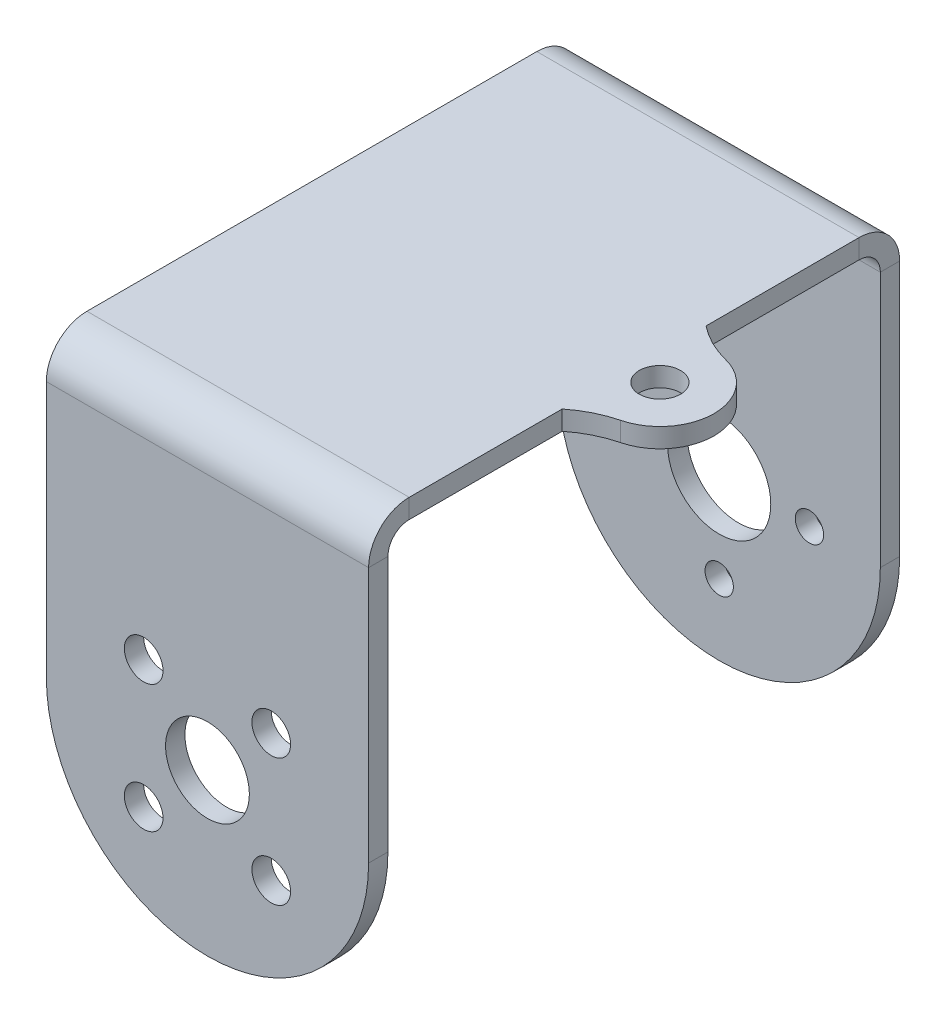
ISO-10303-21;
HEADER;
FILE_DESCRIPTION(('STEP AP214'),'2;1');
FILE_NAME('part.step','',(''),(''),'','','');
FILE_SCHEMA(('AUTOMOTIVE_DESIGN { 1 0 10303 214 1 1 1 1 }'));
ENDSEC;
DATA;
#1=APPLICATION_CONTEXT('core data for automotive mechanical design processes');
#2=APPLICATION_PROTOCOL_DEFINITION('international standard','automotive_design',2000,#1);
#3=PRODUCT_CONTEXT('',#1,'mechanical');
#4=PRODUCT('Part','Part','',(#3));
#5=PRODUCT_RELATED_PRODUCT_CATEGORY('part','',(#4));
#6=PRODUCT_DEFINITION_FORMATION('','',#4);
#7=PRODUCT_DEFINITION_CONTEXT('part definition',#1,'design');
#8=PRODUCT_DEFINITION('design','',#6,#7);
#9=PRODUCT_DEFINITION_SHAPE('','',#8);
#10=(LENGTH_UNIT() NAMED_UNIT(*) SI_UNIT(.MILLI.,.METRE.));
#11=(NAMED_UNIT(*) PLANE_ANGLE_UNIT() SI_UNIT($,.RADIAN.));
#12=(NAMED_UNIT(*) SI_UNIT($,.STERADIAN.) SOLID_ANGLE_UNIT());
#13=UNCERTAINTY_MEASURE_WITH_UNIT(LENGTH_MEASURE(1.E-05),#10,'distance_accuracy_value','');
#14=(GEOMETRIC_REPRESENTATION_CONTEXT(3) GLOBAL_UNCERTAINTY_ASSIGNED_CONTEXT((#13)) GLOBAL_UNIT_ASSIGNED_CONTEXT((#10,
#11,#12)) REPRESENTATION_CONTEXT('',''));
#15=CARTESIAN_POINT('',(0.,0.,0.));
#16=DIRECTION('',(0.,0.,1.));
#17=DIRECTION('',(1.,0.,0.));
#18=AXIS2_PLACEMENT_3D('',#15,#16,#17);
#19=CARTESIAN_POINT('',(12.5,-1.5,19.1));
#20=DIRECTION('',(1.,0.,0.));
#21=DIRECTION('',(0.,0.,-1.));
#22=AXIS2_PLACEMENT_3D('',#19,#20,#21);
#23=PLANE('',#22);
#24=DIRECTION('',(0.,-1.,0.));
#25=VECTOR('',#24,1.);
#26=CARTESIAN_POINT('',(12.5,0.,-5.58170194678879));
#27=LINE('',#26,#25);
#28=CARTESIAN_POINT('',(12.5,0.,-5.58170194678879));
#29=VERTEX_POINT('',#28);
#30=CARTESIAN_POINT('',(12.5,-1.5,-5.58170194678879));
#31=VERTEX_POINT('',#30);
#32=EDGE_CURVE('E225',#29,#31,#27,.T.);
#33=ORIENTED_EDGE('',*,*,#32,.T.);
#34=DIRECTION('',(0.,0.,-1.));
#35=VECTOR('',#34,1.);
#36=CARTESIAN_POINT('',(12.5,-1.5,19.1));
#37=LINE('',#36,#35);
#38=CARTESIAN_POINT('',(12.5,-1.50000000000001,-17.45));
#39=VERTEX_POINT('',#38);
#40=EDGE_CURVE('E434',#31,#39,#37,.T.);
#41=ORIENTED_EDGE('',*,*,#40,.T.);
#42=DIRECTION('',(0.,1.,0.));
#43=VECTOR('',#42,1.);
#44=CARTESIAN_POINT('',(12.5,-1.50000000000001,-17.45));
#45=LINE('',#44,#43);
#46=CARTESIAN_POINT('',(12.5,0.,-17.45));
#47=VERTEX_POINT('',#46);
#48=EDGE_CURVE('E350',#39,#47,#45,.T.);
#49=ORIENTED_EDGE('',*,*,#48,.T.);
#50=DIRECTION('',(0.,0.,-1.));
#51=VECTOR('',#50,1.);
#52=CARTESIAN_POINT('',(12.5,0.,19.1));
#53=LINE('',#52,#51);
#54=EDGE_CURVE('E67',#29,#47,#53,.T.);
#55=ORIENTED_EDGE('',*,*,#54,.F.);
#56=EDGE_LOOP('',(#33,#41,#49,#55));
#57=FACE_BOUND('',#56,.T.);
#58=ADVANCED_FACE('F49',(#57),#23,.T.);
#59=CARTESIAN_POINT('',(0.,-1.5,0.));
#60=DIRECTION('',(0.,1.,0.));
#61=DIRECTION('',(0.,0.,1.));
#62=AXIS2_PLACEMENT_3D('',#59,#60,#61);
#63=PLANE('',#62);
#64=DIRECTION('',(1.,0.,0.));
#65=VECTOR('',#64,1.);
#66=CARTESIAN_POINT('',(12.5,-1.50000000000001,-17.45));
#67=LINE('',#66,#65);
#68=CARTESIAN_POINT('',(-12.5,-1.50000000000001,-17.45));
#69=VERTEX_POINT('',#68);
#70=EDGE_CURVE('E358',#39,#69,#67,.F.);
#71=ORIENTED_EDGE('',*,*,#70,.F.);
#72=ORIENTED_EDGE('',*,*,#40,.F.);
#73=CARTESIAN_POINT('',(17.5,-1.5,-11.8266999451872));
#74=DIRECTION('',(0.,1.,0.));
#75=DIRECTION('',(0.,0.,-1.));
#76=AXIS2_PLACEMENT_3D('',#73,#74,#75);
#77=CIRCLE('',#76,8.);
#78=CARTESIAN_POINT('',(15.5329906036473,-1.5,-4.07228997184557));
#79=VERTEX_POINT('',#78);
#80=EDGE_CURVE('E205',#31,#79,#77,.T.);
#81=ORIENTED_EDGE('',*,*,#80,.T.);
#82=CARTESIAN_POINT('',(14.5,-1.5,-1.30104260698261E-12));
#83=DIRECTION('',(0.,-1.,0.));
#84=DIRECTION('',(0.,0.,-1.));
#85=AXIS2_PLACEMENT_3D('',#82,#83,#84);
#86=CIRCLE('',#85,4.20126352446582);
#87=CARTESIAN_POINT('',(15.5329906036473,-1.5,4.07228997184297));
#88=VERTEX_POINT('',#87);
#89=EDGE_CURVE('E217',#79,#88,#86,.T.);
#90=ORIENTED_EDGE('',*,*,#89,.T.);
#91=CARTESIAN_POINT('',(17.5,-1.5,11.8266999451846));
#92=DIRECTION('',(0.,1.,0.));
#93=DIRECTION('',(0.,0.,-1.));
#94=AXIS2_PLACEMENT_3D('',#91,#92,#93);
#95=CIRCLE('',#94,8.);
#96=CARTESIAN_POINT('',(12.5,-1.5,5.58170194678619));
#97=VERTEX_POINT('',#96);
#98=EDGE_CURVE('E183',#88,#97,#95,.T.);
#99=ORIENTED_EDGE('',*,*,#98,.T.);
#100=CARTESIAN_POINT('',(12.5,-1.5,17.45));
#101=VERTEX_POINT('',#100);
#102=EDGE_CURVE('E435',#101,#97,#37,.T.);
#103=ORIENTED_EDGE('',*,*,#102,.F.);
#104=DIRECTION('',(-1.,0.,0.));
#105=VECTOR('',#104,1.);
#106=CARTESIAN_POINT('',(-12.5,-1.5,17.45));
#107=LINE('',#106,#105);
#108=CARTESIAN_POINT('',(-12.5,-1.5,17.45));
#109=VERTEX_POINT('',#108);
#110=EDGE_CURVE('E416',#109,#101,#107,.F.);
#111=ORIENTED_EDGE('',*,*,#110,.F.);
#112=DIRECTION('',(0.,0.,1.));
#113=VECTOR('',#112,1.);
#114=CARTESIAN_POINT('',(-12.5,-1.5,19.1));
#115=LINE('',#114,#113);
#116=EDGE_CURVE('E430',#69,#109,#115,.T.);
#117=ORIENTED_EDGE('',*,*,#116,.F.);
#118=EDGE_LOOP('',(#71,#72,#81,#90,#99,#103,#111,#117));
#119=FACE_BOUND('',#118,.T.);
#120=CARTESIAN_POINT('',(14.5,-1.5,-1.30104260698261E-12));
#121=DIRECTION('',(0.,-1.,0.));
#122=DIRECTION('',(0.,0.,-1.));
#123=AXIS2_PLACEMENT_3D('',#120,#121,#122);
#124=CIRCLE('',#123,1.6);
#125=CARTESIAN_POINT('',(14.5,-1.5,-1.6000000000013));
#126=VERTEX_POINT('',#125);
#127=EDGE_CURVE('E212',#126,#126,#124,.T.);
#128=ORIENTED_EDGE('',*,*,#127,.F.);
#129=EDGE_LOOP('',(#128));
#130=FACE_BOUND('',#129,.T.);
#131=ADVANCED_FACE('F530',(#119,#130),#63,.F.);
#132=CARTESIAN_POINT('',(0.,0.,0.));
#133=DIRECTION('',(0.,1.,0.));
#134=DIRECTION('',(0.,0.,1.));
#135=AXIS2_PLACEMENT_3D('',#132,#133,#134);
#136=PLANE('',#135);
#137=CARTESIAN_POINT('',(12.5,0.,17.45));
#138=VERTEX_POINT('',#137);
#139=CARTESIAN_POINT('',(12.5,0.,5.58170194678619));
#140=VERTEX_POINT('',#139);
#141=EDGE_CURVE('E199',#138,#140,#53,.T.);
#142=ORIENTED_EDGE('',*,*,#141,.T.);
#143=CARTESIAN_POINT('',(17.5,0.,11.8266999451846));
#144=DIRECTION('',(0.,1.,0.));
#145=DIRECTION('',(0.,0.,-1.));
#146=AXIS2_PLACEMENT_3D('',#143,#144,#145);
#147=CIRCLE('',#146,8.);
#148=CARTESIAN_POINT('',(15.5329906036473,0.,4.07228997184297));
#149=VERTEX_POINT('',#148);
#150=EDGE_CURVE('E181',#149,#140,#147,.T.);
#151=ORIENTED_EDGE('',*,*,#150,.F.);
#152=CARTESIAN_POINT('',(14.5,0.,-1.30104260698261E-12));
#153=DIRECTION('',(0.,-1.,0.));
#154=DIRECTION('',(0.,0.,-1.));
#155=AXIS2_PLACEMENT_3D('',#152,#153,#154);
#156=CIRCLE('',#155,4.20126352446582);
#157=CARTESIAN_POINT('',(15.5329906036473,0.,-4.07228997184557));
#158=VERTEX_POINT('',#157);
#159=EDGE_CURVE('E196',#158,#149,#156,.T.);
#160=ORIENTED_EDGE('',*,*,#159,.F.);
#161=CARTESIAN_POINT('',(17.5,0.,-11.8266999451872));
#162=DIRECTION('',(0.,1.,0.));
#163=DIRECTION('',(0.,0.,-1.));
#164=AXIS2_PLACEMENT_3D('',#161,#162,#163);
#165=CIRCLE('',#164,8.);
#166=EDGE_CURVE('E189',#29,#158,#165,.T.);
#167=ORIENTED_EDGE('',*,*,#166,.F.);
#168=ORIENTED_EDGE('',*,*,#54,.T.);
#169=DIRECTION('',(1.,0.,0.));
#170=VECTOR('',#169,1.);
#171=CARTESIAN_POINT('',(12.5,0.,-17.45));
#172=LINE('',#171,#170);
#173=CARTESIAN_POINT('',(-12.5,0.,-17.45));
#174=VERTEX_POINT('',#173);
#175=EDGE_CURVE('E341',#47,#174,#172,.F.);
#176=ORIENTED_EDGE('',*,*,#175,.T.);
#177=DIRECTION('',(0.,0.,1.));
#178=VECTOR('',#177,1.);
#179=CARTESIAN_POINT('',(-12.5,0.,19.1));
#180=LINE('',#179,#178);
#181=CARTESIAN_POINT('',(-12.5,0.,17.45));
#182=VERTEX_POINT('',#181);
#183=EDGE_CURVE('E426',#174,#182,#180,.T.);
#184=ORIENTED_EDGE('',*,*,#183,.T.);
#185=DIRECTION('',(-1.,0.,0.));
#186=VECTOR('',#185,1.);
#187=CARTESIAN_POINT('',(-12.5,0.,17.45));
#188=LINE('',#187,#186);
#189=EDGE_CURVE('E400',#182,#138,#188,.F.);
#190=ORIENTED_EDGE('',*,*,#189,.T.);
#191=EDGE_LOOP('',(#142,#151,#160,#167,#168,#176,#184,#190));
#192=FACE_BOUND('',#191,.T.);
#193=CARTESIAN_POINT('',(14.5,0.,-1.30104260698261E-12));
#194=DIRECTION('',(0.,-1.,0.));
#195=DIRECTION('',(0.,0.,-1.));
#196=AXIS2_PLACEMENT_3D('',#193,#194,#195);
#197=CIRCLE('',#196,1.6);
#198=CARTESIAN_POINT('',(14.5,0.,-1.6000000000013));
#199=VERTEX_POINT('',#198);
#200=EDGE_CURVE('E220',#199,#199,#197,.T.);
#201=ORIENTED_EDGE('',*,*,#200,.T.);
#202=EDGE_LOOP('',(#201));
#203=FACE_BOUND('',#202,.T.);
#204=ADVANCED_FACE('F193',(#192,#203),#136,.T.);
#205=DIRECTION('',(0.,-1.,0.));
#206=VECTOR('',#205,1.);
#207=CARTESIAN_POINT('',(12.5,0.,5.58170194678619));
#208=LINE('',#207,#206);
#209=EDGE_CURVE('E75',#140,#97,#208,.T.);
#210=ORIENTED_EDGE('',*,*,#209,.F.);
#211=ORIENTED_EDGE('',*,*,#141,.F.);
#212=DIRECTION('',(0.,1.,0.));
#213=VECTOR('',#212,1.);
#214=CARTESIAN_POINT('',(12.5,-1.5,17.45));
#215=LINE('',#214,#213);
#216=EDGE_CURVE('E422',#101,#138,#215,.T.);
#217=ORIENTED_EDGE('',*,*,#216,.F.);
#218=ORIENTED_EDGE('',*,*,#102,.T.);
#219=EDGE_LOOP('',(#210,#211,#217,#218));
#220=FACE_BOUND('',#219,.T.);
#221=ADVANCED_FACE('F542',(#220),#23,.T.);
#222=CARTESIAN_POINT('',(-12.5,-1.5,19.1));
#223=DIRECTION('',(-1.,0.,0.));
#224=DIRECTION('',(0.,0.,1.));
#225=AXIS2_PLACEMENT_3D('',#222,#223,#224);
#226=PLANE('',#225);
#227=DIRECTION('',(0.,1.,0.));
#228=VECTOR('',#227,1.);
#229=CARTESIAN_POINT('',(-12.5,-1.50000000000001,-17.45));
#230=LINE('',#229,#228);
#231=EDGE_CURVE('E364',#69,#174,#230,.T.);
#232=ORIENTED_EDGE('',*,*,#231,.F.);
#233=ORIENTED_EDGE('',*,*,#116,.T.);
#234=DIRECTION('',(0.,1.,0.));
#235=VECTOR('',#234,1.);
#236=CARTESIAN_POINT('',(-12.5,-1.5,17.45));
#237=LINE('',#236,#235);
#238=EDGE_CURVE('E408',#109,#182,#237,.T.);
#239=ORIENTED_EDGE('',*,*,#238,.T.);
#240=ORIENTED_EDGE('',*,*,#183,.F.);
#241=EDGE_LOOP('',(#232,#233,#239,#240));
#242=FACE_BOUND('',#241,.T.);
#243=ADVANCED_FACE('F527',(#242),#226,.T.);
#244=CARTESIAN_POINT('',(12.5,-3.15,17.45));
#245=DIRECTION('',(1.,0.,0.));
#246=DIRECTION('',(0.,0.,-1.));
#247=AXIS2_PLACEMENT_3D('',#244,#245,#246);
#248=PLANE('',#247);
#249=DIRECTION('',(0.,0.,1.));
#250=VECTOR('',#249,1.);
#251=CARTESIAN_POINT('',(12.5,-3.15,19.1));
#252=LINE('',#251,#250);
#253=CARTESIAN_POINT('',(12.5,-3.14999999999999,19.1));
#254=VERTEX_POINT('',#253);
#255=CARTESIAN_POINT('',(12.5,-3.14999999999999,20.6));
#256=VERTEX_POINT('',#255);
#257=EDGE_CURVE('E368',#254,#256,#252,.T.);
#258=ORIENTED_EDGE('',*,*,#257,.F.);
#259=CARTESIAN_POINT('',(12.5,-3.15,17.45));
#260=DIRECTION('',(-1.,0.,0.));
#261=DIRECTION('',(0.,0.,1.));
#262=AXIS2_PLACEMENT_3D('',#259,#260,#261);
#263=CIRCLE('',#262,1.65);
#264=EDGE_CURVE('E412',#101,#254,#263,.F.);
#265=ORIENTED_EDGE('',*,*,#264,.F.);
#266=ORIENTED_EDGE('',*,*,#216,.T.);
#267=CARTESIAN_POINT('',(12.5,-3.15,17.45));
#268=DIRECTION('',(-1.,0.,0.));
#269=DIRECTION('',(0.,0.,1.));
#270=AXIS2_PLACEMENT_3D('',#267,#268,#269);
#271=CIRCLE('',#270,3.15);
#272=EDGE_CURVE('E403',#138,#256,#271,.F.);
#273=ORIENTED_EDGE('',*,*,#272,.T.);
#274=EDGE_LOOP('',(#258,#265,#266,#273));
#275=FACE_BOUND('',#274,.T.);
#276=ADVANCED_FACE('F541',(#275),#248,.T.);
#277=CARTESIAN_POINT('',(-12.5,-3.15,17.45));
#278=DIRECTION('',(1.,0.,0.));
#279=DIRECTION('',(0.,0.,-1.));
#280=AXIS2_PLACEMENT_3D('',#277,#278,#279);
#281=PLANE('',#280);
#282=CARTESIAN_POINT('',(-12.5,-3.15,17.45));
#283=DIRECTION('',(-1.,0.,0.));
#284=DIRECTION('',(0.,0.,1.));
#285=AXIS2_PLACEMENT_3D('',#282,#283,#284);
#286=CIRCLE('',#285,1.65);
#287=CARTESIAN_POINT('',(-12.5,-3.14999999999999,19.1));
#288=VERTEX_POINT('',#287);
#289=EDGE_CURVE('E394',#288,#109,#286,.T.);
#290=ORIENTED_EDGE('',*,*,#289,.F.);
#291=DIRECTION('',(0.,0.,1.));
#292=VECTOR('',#291,1.);
#293=CARTESIAN_POINT('',(-12.5,-3.15,19.1));
#294=LINE('',#293,#292);
#295=CARTESIAN_POINT('',(-12.5,-3.15,20.6));
#296=VERTEX_POINT('',#295);
#297=EDGE_CURVE('E374',#288,#296,#294,.T.);
#298=ORIENTED_EDGE('',*,*,#297,.T.);
#299=CARTESIAN_POINT('',(-12.5,-3.15,17.45));
#300=DIRECTION('',(-1.,0.,0.));
#301=DIRECTION('',(0.,0.,1.));
#302=AXIS2_PLACEMENT_3D('',#299,#300,#301);
#303=CIRCLE('',#302,3.15);
#304=EDGE_CURVE('E404',#296,#182,#303,.T.);
#305=ORIENTED_EDGE('',*,*,#304,.T.);
#306=ORIENTED_EDGE('',*,*,#238,.F.);
#307=EDGE_LOOP('',(#290,#298,#305,#306));
#308=FACE_BOUND('',#307,.T.);
#309=ADVANCED_FACE('F636',(#308),#281,.F.);
#310=CARTESIAN_POINT('',(-12.5,-3.15,17.45));
#311=DIRECTION('',(-1.,0.,0.));
#312=DIRECTION('',(0.,0.,1.));
#313=AXIS2_PLACEMENT_3D('',#310,#311,#312);
#314=CYLINDRICAL_SURFACE('',#313,3.15);
#315=ORIENTED_EDGE('',*,*,#189,.F.);
#316=ORIENTED_EDGE('',*,*,#304,.F.);
#317=DIRECTION('',(1.,0.,0.));
#318=VECTOR('',#317,1.);
#319=CARTESIAN_POINT('',(0.,-3.15,20.6));
#320=LINE('',#319,#318);
#321=EDGE_CURVE('E378',#296,#256,#320,.T.);
#322=ORIENTED_EDGE('',*,*,#321,.T.);
#323=ORIENTED_EDGE('',*,*,#272,.F.);
#324=EDGE_LOOP('',(#315,#316,#322,#323));
#325=FACE_BOUND('',#324,.T.);
#326=ADVANCED_FACE('F639',(#325),#314,.T.);
#327=CARTESIAN_POINT('',(-12.5,-3.15,17.45));
#328=DIRECTION('',(-1.,0.,0.));
#329=DIRECTION('',(0.,0.,1.));
#330=AXIS2_PLACEMENT_3D('',#327,#328,#329);
#331=CYLINDRICAL_SURFACE('',#330,1.65);
#332=ORIENTED_EDGE('',*,*,#110,.T.);
#333=ORIENTED_EDGE('',*,*,#264,.T.);
#334=DIRECTION('',(-1.,0.,0.));
#335=VECTOR('',#334,1.);
#336=CARTESIAN_POINT('',(12.5,-3.15,19.1));
#337=LINE('',#336,#335);
#338=EDGE_CURVE('E371',#254,#288,#337,.T.);
#339=ORIENTED_EDGE('',*,*,#338,.T.);
#340=ORIENTED_EDGE('',*,*,#289,.T.);
#341=EDGE_LOOP('',(#332,#333,#339,#340));
#342=FACE_BOUND('',#341,.T.);
#343=ADVANCED_FACE('F535',(#342),#331,.F.);
#344=CARTESIAN_POINT('',(-12.5,-35.5,20.6000000000001));
#345=DIRECTION('',(1.,0.,0.));
#346=DIRECTION('',(0.,1.,0.));
#347=AXIS2_PLACEMENT_3D('',#344,#345,#346);
#348=PLANE('',#347);
#349=DIRECTION('',(0.,-1.,0.));
#350=VECTOR('',#349,1.);
#351=CARTESIAN_POINT('',(-12.5,-35.5,19.1000000000001));
#352=LINE('',#351,#350);
#353=CARTESIAN_POINT('',(-12.5,-23.,19.1000000000001));
#354=VERTEX_POINT('',#353);
#355=EDGE_CURVE('E385',#288,#354,#352,.T.);
#356=ORIENTED_EDGE('',*,*,#355,.T.);
#357=DIRECTION('',(0.,0.,-1.));
#358=VECTOR('',#357,1.);
#359=CARTESIAN_POINT('',(-12.5,-23.,20.6000000000001));
#360=LINE('',#359,#358);
#361=CARTESIAN_POINT('',(-12.5,-23.,20.6000000000001));
#362=VERTEX_POINT('',#361);
#363=EDGE_CURVE('E459',#354,#362,#360,.F.);
#364=ORIENTED_EDGE('',*,*,#363,.T.);
#365=DIRECTION('',(0.,-1.,0.));
#366=VECTOR('',#365,1.);
#367=CARTESIAN_POINT('',(-12.5,-35.5,20.6000000000001));
#368=LINE('',#367,#366);
#369=EDGE_CURVE('E386',#296,#362,#368,.T.);
#370=ORIENTED_EDGE('',*,*,#369,.F.);
#371=ORIENTED_EDGE('',*,*,#297,.F.);
#372=EDGE_LOOP('',(#356,#364,#370,#371));
#373=FACE_BOUND('',#372,.T.);
#374=ADVANCED_FACE('F645',(#373),#348,.F.);
#375=CARTESIAN_POINT('',(12.5,-1.49999999999999,20.6));
#376=DIRECTION('',(-1.,0.,0.));
#377=DIRECTION('',(0.,0.,1.));
#378=AXIS2_PLACEMENT_3D('',#375,#376,#377);
#379=PLANE('',#378);
#380=DIRECTION('',(0.,1.,0.));
#381=VECTOR('',#380,1.);
#382=CARTESIAN_POINT('',(12.5,-1.49999999999999,20.6));
#383=LINE('',#382,#381);
#384=CARTESIAN_POINT('',(12.5,-23.,20.6000000000001));
#385=VERTEX_POINT('',#384);
#386=EDGE_CURVE('E390',#385,#256,#383,.T.);
#387=ORIENTED_EDGE('',*,*,#386,.F.);
#388=DIRECTION('',(0.,0.,-1.));
#389=VECTOR('',#388,1.);
#390=CARTESIAN_POINT('',(12.5,-23.,20.6000000000001));
#391=LINE('',#390,#389);
#392=CARTESIAN_POINT('',(12.5,-23.,19.1000000000001));
#393=VERTEX_POINT('',#392);
#394=EDGE_CURVE('E438',#385,#393,#391,.T.);
#395=ORIENTED_EDGE('',*,*,#394,.T.);
#396=DIRECTION('',(0.,1.,0.));
#397=VECTOR('',#396,1.);
#398=CARTESIAN_POINT('',(12.5,-1.5,19.1));
#399=LINE('',#398,#397);
#400=EDGE_CURVE('E391',#393,#254,#399,.T.);
#401=ORIENTED_EDGE('',*,*,#400,.T.);
#402=ORIENTED_EDGE('',*,*,#257,.T.);
#403=EDGE_LOOP('',(#387,#395,#401,#402));
#404=FACE_BOUND('',#403,.T.);
#405=ADVANCED_FACE('F651',(#404),#379,.F.);
#406=CARTESIAN_POINT('',(0.,0.,20.6));
#407=DIRECTION('',(0.,0.,-1.));
#408=DIRECTION('',(0.,1.,0.));
#409=AXIS2_PLACEMENT_3D('',#406,#407,#408);
#410=PLANE('',#409);
#411=CARTESIAN_POINT('',(4.94974746830584,-18.0502525316942,20.6));
#412=DIRECTION('',(0.,0.,1.));
#413=DIRECTION('',(1.,0.,0.));
#414=AXIS2_PLACEMENT_3D('',#411,#412,#413);
#415=CIRCLE('',#414,1.5);
#416=CARTESIAN_POINT('',(6.44974746830584,-18.0502525316942,20.6));
#417=VERTEX_POINT('',#416);
#418=EDGE_CURVE('E288',#417,#417,#415,.T.);
#419=ORIENTED_EDGE('',*,*,#418,.F.);
#420=EDGE_LOOP('',(#419));
#421=FACE_BOUND('',#420,.T.);
#422=CARTESIAN_POINT('',(-4.94974746830583,-27.9497474683058,20.6));
#423=DIRECTION('',(0.,0.,1.));
#424=DIRECTION('',(1.,0.,0.));
#425=AXIS2_PLACEMENT_3D('',#422,#423,#424);
#426=CIRCLE('',#425,1.5);
#427=CARTESIAN_POINT('',(-3.44974746830583,-27.9497474683058,20.6));
#428=VERTEX_POINT('',#427);
#429=EDGE_CURVE('E281',#428,#428,#426,.T.);
#430=ORIENTED_EDGE('',*,*,#429,.F.);
#431=EDGE_LOOP('',(#430));
#432=FACE_BOUND('',#431,.T.);
#433=CARTESIAN_POINT('',(4.94974746830584,-27.9497474683058,20.6));
#434=DIRECTION('',(0.,0.,1.));
#435=DIRECTION('',(1.,0.,0.));
#436=AXIS2_PLACEMENT_3D('',#433,#434,#435);
#437=CIRCLE('',#436,1.5);
#438=CARTESIAN_POINT('',(6.44974746830584,-27.9497474683058,20.6));
#439=VERTEX_POINT('',#438);
#440=EDGE_CURVE('E272',#439,#439,#437,.T.);
#441=ORIENTED_EDGE('',*,*,#440,.F.);
#442=EDGE_LOOP('',(#441));
#443=FACE_BOUND('',#442,.T.);
#444=CARTESIAN_POINT('',(0.,-23.,20.6));
#445=DIRECTION('',(0.,0.,1.));
#446=DIRECTION('',(1.,0.,0.));
#447=AXIS2_PLACEMENT_3D('',#444,#445,#446);
#448=CIRCLE('',#447,3.25000000000001);
#449=CARTESIAN_POINT('',(3.25000000000001,-23.,20.6));
#450=VERTEX_POINT('',#449);
#451=EDGE_CURVE('E268',#450,#450,#448,.T.);
#452=ORIENTED_EDGE('',*,*,#451,.F.);
#453=EDGE_LOOP('',(#452));
#454=FACE_BOUND('',#453,.T.);
#455=CARTESIAN_POINT('',(-4.94974746830583,-18.0502525316942,20.6));
#456=DIRECTION('',(0.,0.,1.));
#457=DIRECTION('',(1.,0.,0.));
#458=AXIS2_PLACEMENT_3D('',#455,#456,#457);
#459=CIRCLE('',#458,1.5);
#460=CARTESIAN_POINT('',(-3.44974746830583,-18.0502525316942,20.6));
#461=VERTEX_POINT('',#460);
#462=EDGE_CURVE('E307',#461,#461,#459,.T.);
#463=ORIENTED_EDGE('',*,*,#462,.F.);
#464=EDGE_LOOP('',(#463));
#465=FACE_BOUND('',#464,.T.);
#466=CARTESIAN_POINT('',(0.,-23.,20.6000000000001));
#467=DIRECTION('',(0.,0.,-1.));
#468=DIRECTION('',(0.,1.,0.));
#469=AXIS2_PLACEMENT_3D('',#466,#467,#468);
#470=CIRCLE('',#469,12.5);
#471=CARTESIAN_POINT('',(0.,-35.5,20.6000000000001));
#472=VERTEX_POINT('',#471);
#473=EDGE_CURVE('E453',#362,#472,#470,.F.);
#474=ORIENTED_EDGE('',*,*,#473,.T.);
#475=CARTESIAN_POINT('',(0.,-23.,20.6000000000001));
#476=DIRECTION('',(0.,0.,-1.));
#477=DIRECTION('',(0.,1.,0.));
#478=AXIS2_PLACEMENT_3D('',#475,#476,#477);
#479=CIRCLE('',#478,12.5);
#480=EDGE_CURVE('E456',#472,#385,#479,.F.);
#481=ORIENTED_EDGE('',*,*,#480,.T.);
#482=ORIENTED_EDGE('',*,*,#386,.T.);
#483=ORIENTED_EDGE('',*,*,#321,.F.);
#484=ORIENTED_EDGE('',*,*,#369,.T.);
#485=EDGE_LOOP('',(#474,#481,#482,#483,#484));
#486=FACE_BOUND('',#485,.T.);
#487=ADVANCED_FACE('F655',(#421,#432,#443,#454,#465,#486),#410,.F.);
#488=CARTESIAN_POINT('',(0.,0.,19.1));
#489=DIRECTION('',(0.,0.,-1.));
#490=DIRECTION('',(0.,1.,0.));
#491=AXIS2_PLACEMENT_3D('',#488,#489,#490);
#492=PLANE('',#491);
#493=CARTESIAN_POINT('',(4.94974746830584,-18.0502525316942,19.1000000000001));
#494=DIRECTION('',(0.,0.,-1.));
#495=DIRECTION('',(0.,1.,0.));
#496=AXIS2_PLACEMENT_3D('',#493,#494,#495);
#497=CIRCLE('',#496,1.5);
#498=CARTESIAN_POINT('',(4.94974746830584,-16.5502525316942,19.1000000000001));
#499=VERTEX_POINT('',#498);
#500=EDGE_CURVE('E292',#499,#499,#497,.F.);
#501=ORIENTED_EDGE('',*,*,#500,.T.);
#502=EDGE_LOOP('',(#501));
#503=FACE_BOUND('',#502,.T.);
#504=CARTESIAN_POINT('',(-4.94974746830583,-27.9497474683058,19.1000000000001));
#505=DIRECTION('',(0.,0.,-1.));
#506=DIRECTION('',(0.,1.,0.));
#507=AXIS2_PLACEMENT_3D('',#504,#505,#506);
#508=CIRCLE('',#507,1.5);
#509=CARTESIAN_POINT('',(-4.94974746830583,-26.4497474683058,19.1000000000001));
#510=VERTEX_POINT('',#509);
#511=EDGE_CURVE('E293',#510,#510,#508,.F.);
#512=ORIENTED_EDGE('',*,*,#511,.T.);
#513=EDGE_LOOP('',(#512));
#514=FACE_BOUND('',#513,.T.);
#515=CARTESIAN_POINT('',(4.94974746830584,-27.9497474683058,19.1000000000001));
#516=DIRECTION('',(0.,0.,-1.));
#517=DIRECTION('',(0.,1.,0.));
#518=AXIS2_PLACEMENT_3D('',#515,#516,#517);
#519=CIRCLE('',#518,1.5);
#520=CARTESIAN_POINT('',(4.94974746830584,-26.4497474683058,19.1000000000001));
#521=VERTEX_POINT('',#520);
#522=EDGE_CURVE('E276',#521,#521,#519,.F.);
#523=ORIENTED_EDGE('',*,*,#522,.T.);
#524=EDGE_LOOP('',(#523));
#525=FACE_BOUND('',#524,.T.);
#526=CARTESIAN_POINT('',(0.,-23.,19.1000000000001));
#527=DIRECTION('',(0.,0.,-1.));
#528=DIRECTION('',(0.,1.,0.));
#529=AXIS2_PLACEMENT_3D('',#526,#527,#528);
#530=CIRCLE('',#529,3.25000000000001);
#531=CARTESIAN_POINT('',(0.,-19.75,19.1000000000001));
#532=VERTEX_POINT('',#531);
#533=EDGE_CURVE('E277',#532,#532,#530,.F.);
#534=ORIENTED_EDGE('',*,*,#533,.T.);
#535=EDGE_LOOP('',(#534));
#536=FACE_BOUND('',#535,.T.);
#537=CARTESIAN_POINT('',(-4.94974746830583,-18.0502525316942,19.1000000000001));
#538=DIRECTION('',(0.,0.,-1.));
#539=DIRECTION('',(0.,1.,0.));
#540=AXIS2_PLACEMENT_3D('',#537,#538,#539);
#541=CIRCLE('',#540,1.5);
#542=CARTESIAN_POINT('',(-4.94974746830583,-16.5502525316942,19.1000000000001));
#543=VERTEX_POINT('',#542);
#544=EDGE_CURVE('E297',#543,#543,#541,.F.);
#545=ORIENTED_EDGE('',*,*,#544,.T.);
#546=EDGE_LOOP('',(#545));
#547=FACE_BOUND('',#546,.T.);
#548=ORIENTED_EDGE('',*,*,#400,.F.);
#549=CARTESIAN_POINT('',(0.,-23.,19.1000000000001));
#550=DIRECTION('',(0.,0.,-1.));
#551=DIRECTION('',(0.,1.,0.));
#552=AXIS2_PLACEMENT_3D('',#549,#550,#551);
#553=CIRCLE('',#552,12.5);
#554=CARTESIAN_POINT('',(0.,-35.5,19.1000000000001));
#555=VERTEX_POINT('',#554);
#556=EDGE_CURVE('E450',#393,#555,#553,.T.);
#557=ORIENTED_EDGE('',*,*,#556,.T.);
#558=CARTESIAN_POINT('',(0.,-23.,19.1000000000001));
#559=DIRECTION('',(0.,0.,-1.));
#560=DIRECTION('',(0.,1.,0.));
#561=AXIS2_PLACEMENT_3D('',#558,#559,#560);
#562=CIRCLE('',#561,12.5);
#563=EDGE_CURVE('E447',#555,#354,#562,.T.);
#564=ORIENTED_EDGE('',*,*,#563,.T.);
#565=ORIENTED_EDGE('',*,*,#355,.F.);
#566=ORIENTED_EDGE('',*,*,#338,.F.);
#567=EDGE_LOOP('',(#548,#557,#564,#565,#566));
#568=FACE_BOUND('',#567,.T.);
#569=ADVANCED_FACE('F657',(#503,#514,#525,#536,#547,#568),#492,.T.);
#570=CARTESIAN_POINT('',(-12.5,-3.15000000000001,-17.45));
#571=DIRECTION('',(-1.,0.,0.));
#572=DIRECTION('',(0.,0.,1.));
#573=AXIS2_PLACEMENT_3D('',#570,#571,#572);
#574=PLANE('',#573);
#575=DIRECTION('',(0.,0.,-1.));
#576=VECTOR('',#575,1.);
#577=CARTESIAN_POINT('',(-12.5,-3.15,-19.1));
#578=LINE('',#577,#576);
#579=CARTESIAN_POINT('',(-12.5,-3.15,-19.1));
#580=VERTEX_POINT('',#579);
#581=CARTESIAN_POINT('',(-12.5,-3.15,-20.6));
#582=VERTEX_POINT('',#581);
#583=EDGE_CURVE('E311',#580,#582,#578,.T.);
#584=ORIENTED_EDGE('',*,*,#583,.F.);
#585=CARTESIAN_POINT('',(-12.5,-3.15000000000001,-17.45));
#586=DIRECTION('',(1.,0.,0.));
#587=DIRECTION('',(0.,0.,-1.));
#588=AXIS2_PLACEMENT_3D('',#585,#586,#587);
#589=CIRCLE('',#588,1.65);
#590=EDGE_CURVE('E354',#69,#580,#589,.F.);
#591=ORIENTED_EDGE('',*,*,#590,.F.);
#592=ORIENTED_EDGE('',*,*,#231,.T.);
#593=CARTESIAN_POINT('',(-12.5,-3.15000000000001,-17.45));
#594=DIRECTION('',(1.,0.,0.));
#595=DIRECTION('',(0.,0.,-1.));
#596=AXIS2_PLACEMENT_3D('',#593,#594,#595);
#597=CIRCLE('',#596,3.15);
#598=EDGE_CURVE('E345',#174,#582,#597,.F.);
#599=ORIENTED_EDGE('',*,*,#598,.T.);
#600=EDGE_LOOP('',(#584,#591,#592,#599));
#601=FACE_BOUND('',#600,.T.);
#602=ADVANCED_FACE('F516',(#601),#574,.T.);
#603=CARTESIAN_POINT('',(12.5,-3.15000000000001,-17.45));
#604=DIRECTION('',(-1.,0.,0.));
#605=DIRECTION('',(0.,0.,1.));
#606=AXIS2_PLACEMENT_3D('',#603,#604,#605);
#607=PLANE('',#606);
#608=CARTESIAN_POINT('',(12.5,-3.15000000000001,-17.45));
#609=DIRECTION('',(1.,0.,0.));
#610=DIRECTION('',(0.,0.,-1.));
#611=AXIS2_PLACEMENT_3D('',#608,#609,#610);
#612=CIRCLE('',#611,1.65);
#613=CARTESIAN_POINT('',(12.5,-3.15,-19.1));
#614=VERTEX_POINT('',#613);
#615=EDGE_CURVE('E335',#614,#39,#612,.T.);
#616=ORIENTED_EDGE('',*,*,#615,.F.);
#617=DIRECTION('',(0.,0.,-1.));
#618=VECTOR('',#617,1.);
#619=CARTESIAN_POINT('',(12.5,-3.15,-19.1));
#620=LINE('',#619,#618);
#621=CARTESIAN_POINT('',(12.5,-3.14999999999999,-20.6));
#622=VERTEX_POINT('',#621);
#623=EDGE_CURVE('E315',#614,#622,#620,.T.);
#624=ORIENTED_EDGE('',*,*,#623,.T.);
#625=CARTESIAN_POINT('',(12.5,-3.15000000000001,-17.45));
#626=DIRECTION('',(1.,0.,0.));
#627=DIRECTION('',(0.,0.,-1.));
#628=AXIS2_PLACEMENT_3D('',#625,#626,#627);
#629=CIRCLE('',#628,3.15);
#630=EDGE_CURVE('E346',#622,#47,#629,.T.);
#631=ORIENTED_EDGE('',*,*,#630,.T.);
#632=ORIENTED_EDGE('',*,*,#48,.F.);
#633=EDGE_LOOP('',(#616,#624,#631,#632));
#634=FACE_BOUND('',#633,.T.);
#635=ADVANCED_FACE('F506',(#634),#607,.F.);
#636=CARTESIAN_POINT('',(12.5,-3.15000000000001,-17.45));
#637=DIRECTION('',(1.,0.,0.));
#638=DIRECTION('',(0.,0.,-1.));
#639=AXIS2_PLACEMENT_3D('',#636,#637,#638);
#640=CYLINDRICAL_SURFACE('',#639,3.15);
#641=ORIENTED_EDGE('',*,*,#175,.F.);
#642=ORIENTED_EDGE('',*,*,#630,.F.);
#643=DIRECTION('',(-1.,0.,0.));
#644=VECTOR('',#643,1.);
#645=CARTESIAN_POINT('',(0.,-3.14999999999999,-20.6));
#646=LINE('',#645,#644);
#647=EDGE_CURVE('E319',#622,#582,#646,.T.);
#648=ORIENTED_EDGE('',*,*,#647,.T.);
#649=ORIENTED_EDGE('',*,*,#598,.F.);
#650=EDGE_LOOP('',(#641,#642,#648,#649));
#651=FACE_BOUND('',#650,.T.);
#652=ADVANCED_FACE('F513',(#651),#640,.T.);
#653=CARTESIAN_POINT('',(12.5,-3.15000000000001,-17.45));
#654=DIRECTION('',(1.,0.,0.));
#655=DIRECTION('',(0.,0.,-1.));
#656=AXIS2_PLACEMENT_3D('',#653,#654,#655);
#657=CYLINDRICAL_SURFACE('',#656,1.65);
#658=ORIENTED_EDGE('',*,*,#70,.T.);
#659=ORIENTED_EDGE('',*,*,#590,.T.);
#660=DIRECTION('',(1.,0.,0.));
#661=VECTOR('',#660,1.);
#662=CARTESIAN_POINT('',(-12.5,-3.15,-19.1));
#663=LINE('',#662,#661);
#664=EDGE_CURVE('E312',#580,#614,#663,.T.);
#665=ORIENTED_EDGE('',*,*,#664,.T.);
#666=ORIENTED_EDGE('',*,*,#615,.T.);
#667=EDGE_LOOP('',(#658,#659,#665,#666));
#668=FACE_BOUND('',#667,.T.);
#669=ADVANCED_FACE('F522',(#668),#657,.F.);
#670=CARTESIAN_POINT('',(12.5,-35.5,-20.6000000000001));
#671=DIRECTION('',(-1.,0.,0.));
#672=DIRECTION('',(0.,0.,1.));
#673=AXIS2_PLACEMENT_3D('',#670,#671,#672);
#674=PLANE('',#673);
#675=DIRECTION('',(0.,-1.,0.));
#676=VECTOR('',#675,1.);
#677=CARTESIAN_POINT('',(12.5,-35.5,-19.1000000000001));
#678=LINE('',#677,#676);
#679=CARTESIAN_POINT('',(12.5,-23.,-19.1000000000001));
#680=VERTEX_POINT('',#679);
#681=EDGE_CURVE('E326',#614,#680,#678,.T.);
#682=ORIENTED_EDGE('',*,*,#681,.T.);
#683=DIRECTION('',(0.,0.,1.));
#684=VECTOR('',#683,1.);
#685=CARTESIAN_POINT('',(12.5,-23.,-20.6000000000001));
#686=LINE('',#685,#684);
#687=CARTESIAN_POINT('',(12.5,-23.,-20.6000000000001));
#688=VERTEX_POINT('',#687);
#689=EDGE_CURVE('E11',#680,#688,#686,.F.);
#690=ORIENTED_EDGE('',*,*,#689,.T.);
#691=DIRECTION('',(0.,-1.,0.));
#692=VECTOR('',#691,1.);
#693=CARTESIAN_POINT('',(12.5,-35.5,-20.6000000000001));
#694=LINE('',#693,#692);
#695=EDGE_CURVE('E327',#622,#688,#694,.T.);
#696=ORIENTED_EDGE('',*,*,#695,.F.);
#697=ORIENTED_EDGE('',*,*,#623,.F.);
#698=EDGE_LOOP('',(#682,#690,#696,#697));
#699=FACE_BOUND('',#698,.T.);
#700=ADVANCED_FACE('F501',(#699),#674,.F.);
#701=CARTESIAN_POINT('',(-12.5,-1.49999999999999,-20.6));
#702=DIRECTION('',(1.,0.,0.));
#703=DIRECTION('',(0.,0.,-1.));
#704=AXIS2_PLACEMENT_3D('',#701,#702,#703);
#705=PLANE('',#704);
#706=DIRECTION('',(0.,1.,0.));
#707=VECTOR('',#706,1.);
#708=CARTESIAN_POINT('',(-12.5,-1.49999999999999,-20.6));
#709=LINE('',#708,#707);
#710=CARTESIAN_POINT('',(-12.5,-23.,-20.6000000000001));
#711=VERTEX_POINT('',#710);
#712=EDGE_CURVE('E331',#711,#582,#709,.T.);
#713=ORIENTED_EDGE('',*,*,#712,.F.);
#714=DIRECTION('',(0.,0.,1.));
#715=VECTOR('',#714,1.);
#716=CARTESIAN_POINT('',(-12.5,-23.,-20.6000000000001));
#717=LINE('',#716,#715);
#718=CARTESIAN_POINT('',(-12.5,-23.,-19.1000000000001));
#719=VERTEX_POINT('',#718);
#720=EDGE_CURVE('E462',#711,#719,#717,.T.);
#721=ORIENTED_EDGE('',*,*,#720,.T.);
#722=DIRECTION('',(0.,1.,0.));
#723=VECTOR('',#722,1.);
#724=CARTESIAN_POINT('',(-12.5,-1.5,-19.1));
#725=LINE('',#724,#723);
#726=EDGE_CURVE('E332',#719,#580,#725,.T.);
#727=ORIENTED_EDGE('',*,*,#726,.T.);
#728=ORIENTED_EDGE('',*,*,#583,.T.);
#729=EDGE_LOOP('',(#713,#721,#727,#728));
#730=FACE_BOUND('',#729,.T.);
#731=ADVANCED_FACE('F520',(#730),#705,.F.);
#732=CARTESIAN_POINT('',(0.,0.,-20.6));
#733=DIRECTION('',(0.,0.,1.));
#734=DIRECTION('',(0.,-1.,0.));
#735=AXIS2_PLACEMENT_3D('',#732,#733,#734);
#736=PLANE('',#735);
#737=CARTESIAN_POINT('',(0.,-29.9999999999999,-20.6000000000001));
#738=DIRECTION('',(0.,0.,-1.));
#739=DIRECTION('',(0.,1.,0.));
#740=AXIS2_PLACEMENT_3D('',#737,#738,#739);
#741=CIRCLE('',#740,1.1);
#742=CARTESIAN_POINT('',(0.,-28.8999999999999,-20.6000000000001));
#743=VERTEX_POINT('',#742);
#744=EDGE_CURVE('E253',#743,#743,#741,.T.);
#745=ORIENTED_EDGE('',*,*,#744,.F.);
#746=EDGE_LOOP('',(#745));
#747=FACE_BOUND('',#746,.T.);
#748=CARTESIAN_POINT('',(-6.99999999999999,-22.9999999999998,-20.6000000000001));
#749=DIRECTION('',(0.,0.,-1.));
#750=DIRECTION('',(0.,1.,0.));
#751=AXIS2_PLACEMENT_3D('',#748,#749,#750);
#752=CIRCLE('',#751,1.1);
#753=CARTESIAN_POINT('',(-6.99999999999999,-21.8999999999998,-20.6000000000001));
#754=VERTEX_POINT('',#753);
#755=EDGE_CURVE('E234',#754,#754,#752,.T.);
#756=ORIENTED_EDGE('',*,*,#755,.F.);
#757=EDGE_LOOP('',(#756));
#758=FACE_BOUND('',#757,.T.);
#759=CARTESIAN_POINT('',(7.,-22.9999999999999,-20.6000000000001));
#760=DIRECTION('',(0.,0.,-1.));
#761=DIRECTION('',(0.,1.,0.));
#762=AXIS2_PLACEMENT_3D('',#759,#760,#761);
#763=CIRCLE('',#762,1.1);
#764=CARTESIAN_POINT('',(7.,-21.8999999999999,-20.6000000000001));
#765=VERTEX_POINT('',#764);
#766=EDGE_CURVE('E235',#765,#765,#763,.T.);
#767=ORIENTED_EDGE('',*,*,#766,.F.);
#768=EDGE_LOOP('',(#767));
#769=FACE_BOUND('',#768,.T.);
#770=CARTESIAN_POINT('',(0.,-15.9999999999999,-20.6000000000001));
#771=DIRECTION('',(0.,0.,-1.));
#772=DIRECTION('',(0.,1.,0.));
#773=AXIS2_PLACEMENT_3D('',#770,#771,#772);
#774=CIRCLE('',#773,1.1);
#775=CARTESIAN_POINT('',(0.,-14.8999999999999,-20.6000000000001));
#776=VERTEX_POINT('',#775);
#777=EDGE_CURVE('E243',#776,#776,#774,.T.);
#778=ORIENTED_EDGE('',*,*,#777,.F.);
#779=EDGE_LOOP('',(#778));
#780=FACE_BOUND('',#779,.T.);
#781=CARTESIAN_POINT('',(0.,-22.9999999999999,-20.6000000000001));
#782=DIRECTION('',(0.,0.,-1.));
#783=DIRECTION('',(0.,1.,0.));
#784=AXIS2_PLACEMENT_3D('',#781,#782,#783);
#785=CIRCLE('',#784,3.99999999999999);
#786=CARTESIAN_POINT('',(0.,-18.9999999999999,-20.6000000000001));
#787=VERTEX_POINT('',#786);
#788=EDGE_CURVE('E264',#787,#787,#785,.T.);
#789=ORIENTED_EDGE('',*,*,#788,.F.);
#790=EDGE_LOOP('',(#789));
#791=FACE_BOUND('',#790,.T.);
#792=CARTESIAN_POINT('',(0.,-23.,-20.6000000000001));
#793=DIRECTION('',(0.,0.,1.));
#794=DIRECTION('',(0.,-1.,0.));
#795=AXIS2_PLACEMENT_3D('',#792,#793,#794);
#796=CIRCLE('',#795,12.5);
#797=CARTESIAN_POINT('',(0.,-35.5,-20.6000000000001));
#798=VERTEX_POINT('',#797);
#799=EDGE_CURVE('E472',#688,#798,#796,.F.);
#800=ORIENTED_EDGE('',*,*,#799,.T.);
#801=CARTESIAN_POINT('',(0.,-23.,-20.6000000000001));
#802=DIRECTION('',(0.,0.,1.));
#803=DIRECTION('',(0.,-1.,0.));
#804=AXIS2_PLACEMENT_3D('',#801,#802,#803);
#805=CIRCLE('',#804,12.5);
#806=EDGE_CURVE('E59',#798,#711,#805,.F.);
#807=ORIENTED_EDGE('',*,*,#806,.T.);
#808=ORIENTED_EDGE('',*,*,#712,.T.);
#809=ORIENTED_EDGE('',*,*,#647,.F.);
#810=ORIENTED_EDGE('',*,*,#695,.T.);
#811=EDGE_LOOP('',(#800,#807,#808,#809,#810));
#812=FACE_BOUND('',#811,.T.);
#813=ADVANCED_FACE('F509',(#747,#758,#769,#780,#791,#812),#736,.F.);
#814=CARTESIAN_POINT('',(0.,0.,-19.1));
#815=DIRECTION('',(0.,0.,1.));
#816=DIRECTION('',(0.,-1.,0.));
#817=AXIS2_PLACEMENT_3D('',#814,#815,#816);
#818=PLANE('',#817);
#819=CARTESIAN_POINT('',(0.,-29.9999999999999,-19.1000000000001));
#820=DIRECTION('',(0.,0.,1.));
#821=DIRECTION('',(0.,-1.,0.));
#822=AXIS2_PLACEMENT_3D('',#819,#820,#821);
#823=CIRCLE('',#822,1.1);
#824=CARTESIAN_POINT('',(0.,-31.0999999999999,-19.1000000000001));
#825=VERTEX_POINT('',#824);
#826=EDGE_CURVE('E248',#825,#825,#823,.F.);
#827=ORIENTED_EDGE('',*,*,#826,.T.);
#828=EDGE_LOOP('',(#827));
#829=FACE_BOUND('',#828,.T.);
#830=CARTESIAN_POINT('',(-6.99999999999999,-22.9999999999998,-19.1000000000001));
#831=DIRECTION('',(0.,0.,1.));
#832=DIRECTION('',(0.,-1.,0.));
#833=AXIS2_PLACEMENT_3D('',#830,#831,#832);
#834=CIRCLE('',#833,1.1);
#835=CARTESIAN_POINT('',(-6.99999999999999,-24.0999999999998,-19.1000000000001));
#836=VERTEX_POINT('',#835);
#837=EDGE_CURVE('E257',#836,#836,#834,.F.);
#838=ORIENTED_EDGE('',*,*,#837,.T.);
#839=EDGE_LOOP('',(#838));
#840=FACE_BOUND('',#839,.T.);
#841=CARTESIAN_POINT('',(7.,-22.9999999999999,-19.1000000000001));
#842=DIRECTION('',(0.,0.,1.));
#843=DIRECTION('',(0.,-1.,0.));
#844=AXIS2_PLACEMENT_3D('',#841,#842,#843);
#845=CIRCLE('',#844,1.1);
#846=CARTESIAN_POINT('',(7.,-24.0999999999999,-19.1000000000001));
#847=VERTEX_POINT('',#846);
#848=EDGE_CURVE('E230',#847,#847,#845,.F.);
#849=ORIENTED_EDGE('',*,*,#848,.T.);
#850=EDGE_LOOP('',(#849));
#851=FACE_BOUND('',#850,.T.);
#852=CARTESIAN_POINT('',(0.,-15.9999999999999,-19.1000000000001));
#853=DIRECTION('',(0.,0.,1.));
#854=DIRECTION('',(0.,-1.,0.));
#855=AXIS2_PLACEMENT_3D('',#852,#853,#854);
#856=CIRCLE('',#855,1.1);
#857=CARTESIAN_POINT('',(0.,-17.0999999999999,-19.1000000000001));
#858=VERTEX_POINT('',#857);
#859=EDGE_CURVE('E239',#858,#858,#856,.F.);
#860=ORIENTED_EDGE('',*,*,#859,.T.);
#861=EDGE_LOOP('',(#860));
#862=FACE_BOUND('',#861,.T.);
#863=CARTESIAN_POINT('',(0.,-22.9999999999999,-19.1000000000001));
#864=DIRECTION('',(0.,0.,1.));
#865=DIRECTION('',(0.,-1.,0.));
#866=AXIS2_PLACEMENT_3D('',#863,#864,#865);
#867=CIRCLE('',#866,3.99999999999999);
#868=CARTESIAN_POINT('',(0.,-26.9999999999999,-19.1000000000001));
#869=VERTEX_POINT('',#868);
#870=EDGE_CURVE('E252',#869,#869,#867,.F.);
#871=ORIENTED_EDGE('',*,*,#870,.T.);
#872=EDGE_LOOP('',(#871));
#873=FACE_BOUND('',#872,.T.);
#874=ORIENTED_EDGE('',*,*,#726,.F.);
#875=CARTESIAN_POINT('',(0.,-23.,-19.1000000000001));
#876=DIRECTION('',(0.,0.,1.));
#877=DIRECTION('',(0.,-1.,0.));
#878=AXIS2_PLACEMENT_3D('',#875,#876,#877);
#879=CIRCLE('',#878,12.5);
#880=CARTESIAN_POINT('',(0.,-35.5,-19.1000000000001));
#881=VERTEX_POINT('',#880);
#882=EDGE_CURVE('E469',#719,#881,#879,.T.);
#883=ORIENTED_EDGE('',*,*,#882,.T.);
#884=CARTESIAN_POINT('',(0.,-23.,-19.1000000000001));
#885=DIRECTION('',(0.,0.,1.));
#886=DIRECTION('',(0.,-1.,0.));
#887=AXIS2_PLACEMENT_3D('',#884,#885,#886);
#888=CIRCLE('',#887,12.5);
#889=EDGE_CURVE('E466',#881,#680,#888,.T.);
#890=ORIENTED_EDGE('',*,*,#889,.T.);
#891=ORIENTED_EDGE('',*,*,#681,.F.);
#892=ORIENTED_EDGE('',*,*,#664,.F.);
#893=EDGE_LOOP('',(#874,#883,#890,#891,#892));
#894=FACE_BOUND('',#893,.T.);
#895=ADVANCED_FACE('F497',(#829,#840,#851,#862,#873,#894),#818,.T.);
#896=CARTESIAN_POINT('',(-4.94974746830583,-18.0502525316942,-20.6010000000001));
#897=DIRECTION('',(0.,0.,1.));
#898=DIRECTION('',(1.,0.,0.));
#899=AXIS2_PLACEMENT_3D('',#896,#897,#898);
#900=CYLINDRICAL_SURFACE('',#899,1.5);
#901=ORIENTED_EDGE('',*,*,#544,.F.);
#902=EDGE_LOOP('',(#901));
#903=FACE_BOUND('',#902,.T.);
#904=ORIENTED_EDGE('',*,*,#462,.T.);
#905=EDGE_LOOP('',(#904));
#906=FACE_BOUND('',#905,.T.);
#907=ADVANCED_FACE('F678',(#903,#906),#900,.F.);
#908=CARTESIAN_POINT('',(0.,-23.,-20.6010000000001));
#909=DIRECTION('',(0.,0.,1.));
#910=DIRECTION('',(1.,0.,0.));
#911=AXIS2_PLACEMENT_3D('',#908,#909,#910);
#912=CYLINDRICAL_SURFACE('',#911,3.25000000000001);
#913=ORIENTED_EDGE('',*,*,#533,.F.);
#914=EDGE_LOOP('',(#913));
#915=FACE_BOUND('',#914,.T.);
#916=ORIENTED_EDGE('',*,*,#451,.T.);
#917=EDGE_LOOP('',(#916));
#918=FACE_BOUND('',#917,.T.);
#919=ADVANCED_FACE('F685',(#915,#918),#912,.F.);
#920=CARTESIAN_POINT('',(4.94974746830584,-27.9497474683058,-20.6010000000001));
#921=DIRECTION('',(0.,0.,1.));
#922=DIRECTION('',(1.,0.,0.));
#923=AXIS2_PLACEMENT_3D('',#920,#921,#922);
#924=CYLINDRICAL_SURFACE('',#923,1.5);
#925=ORIENTED_EDGE('',*,*,#522,.F.);
#926=EDGE_LOOP('',(#925));
#927=FACE_BOUND('',#926,.T.);
#928=ORIENTED_EDGE('',*,*,#440,.T.);
#929=EDGE_LOOP('',(#928));
#930=FACE_BOUND('',#929,.T.);
#931=ADVANCED_FACE('F691',(#927,#930),#924,.F.);
#932=CARTESIAN_POINT('',(-4.94974746830583,-27.9497474683058,-20.6010000000001));
#933=DIRECTION('',(0.,0.,1.));
#934=DIRECTION('',(1.,0.,0.));
#935=AXIS2_PLACEMENT_3D('',#932,#933,#934);
#936=CYLINDRICAL_SURFACE('',#935,1.5);
#937=ORIENTED_EDGE('',*,*,#511,.F.);
#938=EDGE_LOOP('',(#937));
#939=FACE_BOUND('',#938,.T.);
#940=ORIENTED_EDGE('',*,*,#429,.T.);
#941=EDGE_LOOP('',(#940));
#942=FACE_BOUND('',#941,.T.);
#943=ADVANCED_FACE('F687',(#939,#942),#936,.F.);
#944=CARTESIAN_POINT('',(4.94974746830584,-18.0502525316942,-20.6010000000001));
#945=DIRECTION('',(0.,0.,1.));
#946=DIRECTION('',(1.,0.,0.));
#947=AXIS2_PLACEMENT_3D('',#944,#945,#946);
#948=CYLINDRICAL_SURFACE('',#947,1.5);
#949=ORIENTED_EDGE('',*,*,#500,.F.);
#950=EDGE_LOOP('',(#949));
#951=FACE_BOUND('',#950,.T.);
#952=ORIENTED_EDGE('',*,*,#418,.T.);
#953=EDGE_LOOP('',(#952));
#954=FACE_BOUND('',#953,.T.);
#955=ADVANCED_FACE('F690',(#951,#954),#948,.F.);
#956=CARTESIAN_POINT('',(0.,-23.,20.6010000000002));
#957=DIRECTION('',(0.,0.,-1.));
#958=DIRECTION('',(0.,1.,0.));
#959=AXIS2_PLACEMENT_3D('',#956,#957,#958);
#960=CYLINDRICAL_SURFACE('',#959,3.99999999999999);
#961=ORIENTED_EDGE('',*,*,#870,.F.);
#962=EDGE_LOOP('',(#961));
#963=FACE_BOUND('',#962,.T.);
#964=ORIENTED_EDGE('',*,*,#788,.T.);
#965=EDGE_LOOP('',(#964));
#966=FACE_BOUND('',#965,.T.);
#967=ADVANCED_FACE('F695',(#963,#966),#960,.F.);
#968=CARTESIAN_POINT('',(0.,-16.,20.6010000000002));
#969=DIRECTION('',(0.,0.,-1.));
#970=DIRECTION('',(0.,1.,0.));
#971=AXIS2_PLACEMENT_3D('',#968,#969,#970);
#972=CYLINDRICAL_SURFACE('',#971,1.1);
#973=ORIENTED_EDGE('',*,*,#859,.F.);
#974=EDGE_LOOP('',(#973));
#975=FACE_BOUND('',#974,.T.);
#976=ORIENTED_EDGE('',*,*,#777,.T.);
#977=EDGE_LOOP('',(#976));
#978=FACE_BOUND('',#977,.T.);
#979=ADVANCED_FACE('F705',(#975,#978),#972,.F.);
#980=CARTESIAN_POINT('',(7.,-23.,20.6010000000002));
#981=DIRECTION('',(0.,0.,-1.));
#982=DIRECTION('',(0.,1.,0.));
#983=AXIS2_PLACEMENT_3D('',#980,#981,#982);
#984=CYLINDRICAL_SURFACE('',#983,1.1);
#985=ORIENTED_EDGE('',*,*,#848,.F.);
#986=EDGE_LOOP('',(#985));
#987=FACE_BOUND('',#986,.T.);
#988=ORIENTED_EDGE('',*,*,#766,.T.);
#989=EDGE_LOOP('',(#988));
#990=FACE_BOUND('',#989,.T.);
#991=ADVANCED_FACE('F711',(#987,#990),#984,.F.);
#992=CARTESIAN_POINT('',(-6.99999999999999,-23.,20.6010000000002));
#993=DIRECTION('',(0.,0.,-1.));
#994=DIRECTION('',(0.,1.,0.));
#995=AXIS2_PLACEMENT_3D('',#992,#993,#994);
#996=CYLINDRICAL_SURFACE('',#995,1.1);
#997=ORIENTED_EDGE('',*,*,#837,.F.);
#998=EDGE_LOOP('',(#997));
#999=FACE_BOUND('',#998,.T.);
#1000=ORIENTED_EDGE('',*,*,#755,.T.);
#1001=EDGE_LOOP('',(#1000));
#1002=FACE_BOUND('',#1001,.T.);
#1003=ADVANCED_FACE('F707',(#999,#1002),#996,.F.);
#1004=CARTESIAN_POINT('',(0.,-30.,20.6010000000001));
#1005=DIRECTION('',(0.,0.,-1.));
#1006=DIRECTION('',(0.,1.,0.));
#1007=AXIS2_PLACEMENT_3D('',#1004,#1005,#1006);
#1008=CYLINDRICAL_SURFACE('',#1007,1.1);
#1009=ORIENTED_EDGE('',*,*,#826,.F.);
#1010=EDGE_LOOP('',(#1009));
#1011=FACE_BOUND('',#1010,.T.);
#1012=ORIENTED_EDGE('',*,*,#744,.T.);
#1013=EDGE_LOOP('',(#1012));
#1014=FACE_BOUND('',#1013,.T.);
#1015=ADVANCED_FACE('F710',(#1011,#1014),#1008,.F.);
#1016=CARTESIAN_POINT('',(0.,-23.,20.6000000000001));
#1017=DIRECTION('',(0.,0.,-1.));
#1018=DIRECTION('',(0.,1.,0.));
#1019=AXIS2_PLACEMENT_3D('',#1016,#1017,#1018);
#1020=CYLINDRICAL_SURFACE('',#1019,12.5);
#1021=DIRECTION('',(0.,0.,-1.));
#1022=VECTOR('',#1021,1.);
#1023=CARTESIAN_POINT('',(0.,-35.5,20.6000000000001));
#1024=LINE('',#1023,#1022);
#1025=EDGE_CURVE('E247',#472,#555,#1024,.T.);
#1026=ORIENTED_EDGE('',*,*,#1025,.F.);
#1027=ORIENTED_EDGE('',*,*,#473,.F.);
#1028=ORIENTED_EDGE('',*,*,#363,.F.);
#1029=ORIENTED_EDGE('',*,*,#563,.F.);
#1030=EDGE_LOOP('',(#1026,#1027,#1028,#1029));
#1031=FACE_BOUND('',#1030,.T.);
#1032=ADVANCED_FACE('F715',(#1031),#1020,.T.);
#1033=CARTESIAN_POINT('',(0.,-23.,20.6000000000001));
#1034=DIRECTION('',(0.,0.,-1.));
#1035=DIRECTION('',(0.,1.,0.));
#1036=AXIS2_PLACEMENT_3D('',#1033,#1034,#1035);
#1037=CYLINDRICAL_SURFACE('',#1036,12.5);
#1038=ORIENTED_EDGE('',*,*,#480,.F.);
#1039=ORIENTED_EDGE('',*,*,#1025,.T.);
#1040=ORIENTED_EDGE('',*,*,#556,.F.);
#1041=ORIENTED_EDGE('',*,*,#394,.F.);
#1042=EDGE_LOOP('',(#1038,#1039,#1040,#1041));
#1043=FACE_BOUND('',#1042,.T.);
#1044=ADVANCED_FACE('F798',(#1043),#1037,.T.);
#1045=CARTESIAN_POINT('',(0.,-23.,-20.6000000000001));
#1046=DIRECTION('',(0.,0.,1.));
#1047=DIRECTION('',(0.,-1.,0.));
#1048=AXIS2_PLACEMENT_3D('',#1045,#1046,#1047);
#1049=CYLINDRICAL_SURFACE('',#1048,12.5);
#1050=DIRECTION('',(0.,0.,1.));
#1051=VECTOR('',#1050,1.);
#1052=CARTESIAN_POINT('',(0.,-35.5,-20.6000000000001));
#1053=LINE('',#1052,#1051);
#1054=EDGE_CURVE('E53',#798,#881,#1053,.T.);
#1055=ORIENTED_EDGE('',*,*,#1054,.F.);
#1056=ORIENTED_EDGE('',*,*,#799,.F.);
#1057=ORIENTED_EDGE('',*,*,#689,.F.);
#1058=ORIENTED_EDGE('',*,*,#889,.F.);
#1059=EDGE_LOOP('',(#1055,#1056,#1057,#1058));
#1060=FACE_BOUND('',#1059,.T.);
#1061=ADVANCED_FACE('F51',(#1060),#1049,.T.);
#1062=CARTESIAN_POINT('',(0.,-23.,-20.6000000000001));
#1063=DIRECTION('',(0.,0.,1.));
#1064=DIRECTION('',(0.,-1.,0.));
#1065=AXIS2_PLACEMENT_3D('',#1062,#1063,#1064);
#1066=CYLINDRICAL_SURFACE('',#1065,12.5);
#1067=ORIENTED_EDGE('',*,*,#806,.F.);
#1068=ORIENTED_EDGE('',*,*,#1054,.T.);
#1069=ORIENTED_EDGE('',*,*,#882,.F.);
#1070=ORIENTED_EDGE('',*,*,#720,.F.);
#1071=EDGE_LOOP('',(#1067,#1068,#1069,#1070));
#1072=FACE_BOUND('',#1071,.T.);
#1073=ADVANCED_FACE('F488',(#1072),#1066,.T.);
#1074=CARTESIAN_POINT('',(14.5,0.,-1.30104260698261E-12));
#1075=DIRECTION('',(0.,-1.,0.));
#1076=DIRECTION('',(0.,0.,-1.));
#1077=AXIS2_PLACEMENT_3D('',#1074,#1075,#1076);
#1078=CYLINDRICAL_SURFACE('',#1077,4.20126352446582);
#1079=ORIENTED_EDGE('',*,*,#89,.F.);
#1080=DIRECTION('',(0.,-1.,0.));
#1081=VECTOR('',#1080,1.);
#1082=CARTESIAN_POINT('',(15.5329906036473,0.,-4.07228997184557));
#1083=LINE('',#1082,#1081);
#1084=EDGE_CURVE('E203',#158,#79,#1083,.T.);
#1085=ORIENTED_EDGE('',*,*,#1084,.F.);
#1086=ORIENTED_EDGE('',*,*,#159,.T.);
#1087=DIRECTION('',(0.,-1.,0.));
#1088=VECTOR('',#1087,1.);
#1089=CARTESIAN_POINT('',(15.5329906036473,0.,4.07228997184297));
#1090=LINE('',#1089,#1088);
#1091=EDGE_CURVE('E178',#149,#88,#1090,.T.);
#1092=ORIENTED_EDGE('',*,*,#1091,.T.);
#1093=EDGE_LOOP('',(#1079,#1085,#1086,#1092));
#1094=FACE_BOUND('',#1093,.T.);
#1095=ADVANCED_FACE('F202',(#1094),#1078,.T.);
#1096=CARTESIAN_POINT('',(17.5,0.,-11.8266999451872));
#1097=DIRECTION('',(0.,-1.,0.));
#1098=DIRECTION('',(0.,0.,-1.));
#1099=AXIS2_PLACEMENT_3D('',#1096,#1097,#1098);
#1100=CYLINDRICAL_SURFACE('',#1099,8.);
#1101=ORIENTED_EDGE('',*,*,#80,.F.);
#1102=ORIENTED_EDGE('',*,*,#32,.F.);
#1103=ORIENTED_EDGE('',*,*,#166,.T.);
#1104=ORIENTED_EDGE('',*,*,#1084,.T.);
#1105=EDGE_LOOP('',(#1101,#1102,#1103,#1104));
#1106=FACE_BOUND('',#1105,.T.);
#1107=ADVANCED_FACE('F545',(#1106),#1100,.F.);
#1108=CARTESIAN_POINT('',(17.5,0.,11.8266999451846));
#1109=DIRECTION('',(0.,-1.,0.));
#1110=DIRECTION('',(0.,0.,-1.));
#1111=AXIS2_PLACEMENT_3D('',#1108,#1109,#1110);
#1112=CYLINDRICAL_SURFACE('',#1111,8.);
#1113=ORIENTED_EDGE('',*,*,#98,.F.);
#1114=ORIENTED_EDGE('',*,*,#1091,.F.);
#1115=ORIENTED_EDGE('',*,*,#150,.T.);
#1116=ORIENTED_EDGE('',*,*,#209,.T.);
#1117=EDGE_LOOP('',(#1113,#1114,#1115,#1116));
#1118=FACE_BOUND('',#1117,.T.);
#1119=ADVANCED_FACE('F180',(#1118),#1112,.F.);
#1120=CARTESIAN_POINT('',(14.5,0.,-1.30104260698261E-12));
#1121=DIRECTION('',(0.,-1.,0.));
#1122=DIRECTION('',(0.,0.,-1.));
#1123=AXIS2_PLACEMENT_3D('',#1120,#1121,#1122);
#1124=CYLINDRICAL_SURFACE('',#1123,1.6);
#1125=ORIENTED_EDGE('',*,*,#200,.F.);
#1126=EDGE_LOOP('',(#1125));
#1127=FACE_BOUND('',#1126,.T.);
#1128=ORIENTED_EDGE('',*,*,#127,.T.);
#1129=EDGE_LOOP('',(#1128));
#1130=FACE_BOUND('',#1129,.T.);
#1131=ADVANCED_FACE('F726',(#1127,#1130),#1124,.F.);
#1132=CLOSED_SHELL('',(#58,#131,#204,#221,#243,#276,#309,#326,#343,#374,#405,#487,#569,#602,
#635,#652,#669,#700,#731,#813,#895,#907,#919,#931,#943,#955,#967,#979,#991,#1003,#1015,#1032,
#1044,#1061,#1073,#1095,#1107,#1119,#1131));
#1133=MANIFOLD_SOLID_BREP('B2',#1132);
#1134=ADVANCED_BREP_SHAPE_REPRESENTATION('',(#18,#1133),#14);
#1135=SHAPE_DEFINITION_REPRESENTATION(#9,#1134);
ENDSEC;
END-ISO-10303-21;
